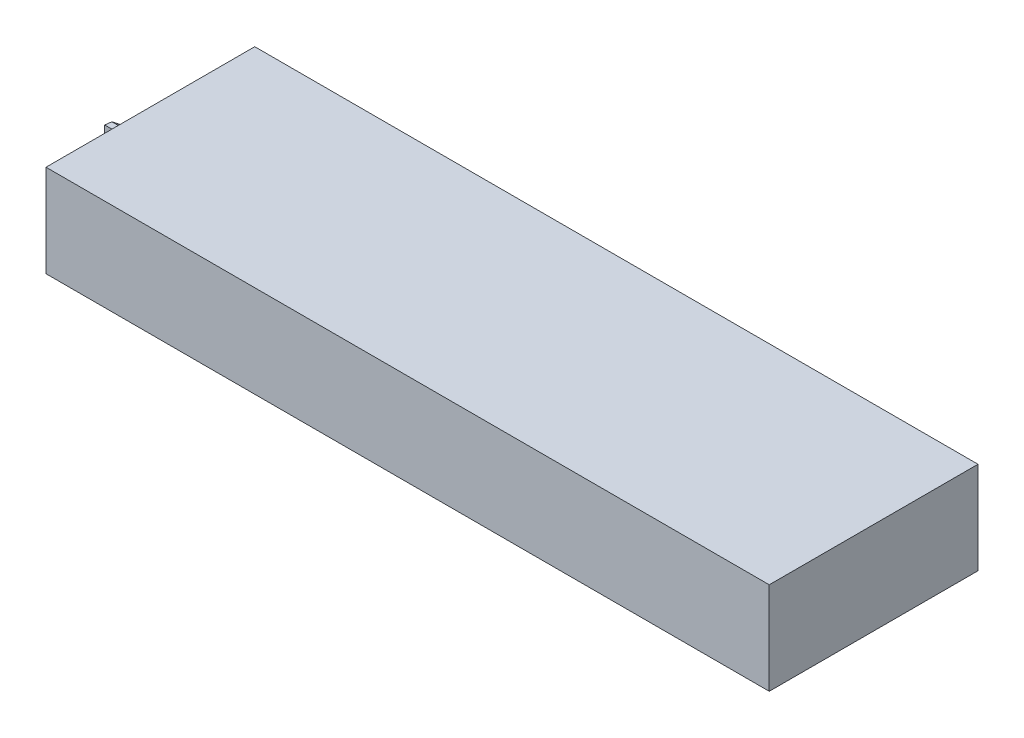
ISO-10303-21;
HEADER;
FILE_DESCRIPTION(('STEP AP214'),'2;1');
FILE_NAME('part.step','',(''),(''),'','','');
FILE_SCHEMA(('AUTOMOTIVE_DESIGN { 1 0 10303 214 1 1 1 1 }'));
ENDSEC;
DATA;
#1=APPLICATION_CONTEXT('core data for automotive mechanical design processes');
#2=APPLICATION_PROTOCOL_DEFINITION('international standard','automotive_design',2000,#1);
#3=PRODUCT_CONTEXT('',#1,'mechanical');
#4=PRODUCT('Part','Part','',(#3));
#5=PRODUCT_RELATED_PRODUCT_CATEGORY('part','',(#4));
#6=PRODUCT_DEFINITION_FORMATION('','',#4);
#7=PRODUCT_DEFINITION_CONTEXT('part definition',#1,'design');
#8=PRODUCT_DEFINITION('design','',#6,#7);
#9=PRODUCT_DEFINITION_SHAPE('','',#8);
#10=(LENGTH_UNIT() NAMED_UNIT(*) SI_UNIT(.MILLI.,.METRE.));
#11=(NAMED_UNIT(*) PLANE_ANGLE_UNIT() SI_UNIT($,.RADIAN.));
#12=(NAMED_UNIT(*) SI_UNIT($,.STERADIAN.) SOLID_ANGLE_UNIT());
#13=UNCERTAINTY_MEASURE_WITH_UNIT(LENGTH_MEASURE(1.E-05),#10,'distance_accuracy_value','');
#14=(GEOMETRIC_REPRESENTATION_CONTEXT(3) GLOBAL_UNCERTAINTY_ASSIGNED_CONTEXT((#13)) GLOBAL_UNIT_ASSIGNED_CONTEXT((#10,
#11,#12)) REPRESENTATION_CONTEXT('',''));
#15=CARTESIAN_POINT('',(0.,0.,0.));
#16=DIRECTION('',(0.,0.,1.));
#17=DIRECTION('',(1.,0.,0.));
#18=AXIS2_PLACEMENT_3D('',#15,#16,#17);
#19=CARTESIAN_POINT('',(-11.,2.8067,-3.175));
#20=DIRECTION('',(1.,0.,0.));
#21=DIRECTION('',(0.,0.,-1.));
#22=AXIS2_PLACEMENT_3D('',#19,#20,#21);
#23=PLANE('',#22);
#24=DIRECTION('',(0.,0.,1.));
#25=VECTOR('',#24,1.);
#26=CARTESIAN_POINT('',(-11.,0.,-3.175));
#27=LINE('',#26,#25);
#28=CARTESIAN_POINT('',(-11.,0.,-3.175));
#29=VERTEX_POINT('',#28);
#30=CARTESIAN_POINT('',(-11.,0.,3.175));
#31=VERTEX_POINT('',#30);
#32=EDGE_CURVE('E354',#29,#31,#27,.T.);
#33=ORIENTED_EDGE('',*,*,#32,.T.);
#34=DIRECTION('',(0.,-1.,0.));
#35=VECTOR('',#34,1.);
#36=CARTESIAN_POINT('',(-11.,2.8067,3.175));
#37=LINE('',#36,#35);
#38=CARTESIAN_POINT('',(-11.,2.8067,3.175));
#39=VERTEX_POINT('',#38);
#40=EDGE_CURVE('E359',#39,#31,#37,.T.);
#41=ORIENTED_EDGE('',*,*,#40,.F.);
#42=DIRECTION('',(0.,0.,1.));
#43=VECTOR('',#42,1.);
#44=CARTESIAN_POINT('',(-11.,2.8067,-3.175));
#45=LINE('',#44,#43);
#46=CARTESIAN_POINT('',(-11.,2.8067,-3.175));
#47=VERTEX_POINT('',#46);
#48=EDGE_CURVE('E345',#47,#39,#45,.T.);
#49=ORIENTED_EDGE('',*,*,#48,.F.);
#50=DIRECTION('',(0.,-1.,0.));
#51=VECTOR('',#50,1.);
#52=CARTESIAN_POINT('',(-11.,2.8067,-3.175));
#53=LINE('',#52,#51);
#54=EDGE_CURVE('E362',#47,#29,#53,.T.);
#55=ORIENTED_EDGE('',*,*,#54,.T.);
#56=EDGE_LOOP('',(#33,#41,#49,#55));
#57=FACE_BOUND('',#56,.T.);
#58=DIRECTION('',(0.,0.,1.));
#59=VECTOR('',#58,1.);
#60=CARTESIAN_POINT('',(-11.,0.92094923076923,0.));
#61=LINE('',#60,#59);
#62=CARTESIAN_POINT('',(-11.,0.92094923076923,0.578007692307692));
#63=VERTEX_POINT('',#62);
#64=CARTESIAN_POINT('',(-11.,0.92094923076923,1.2357));
#65=VERTEX_POINT('',#64);
#66=EDGE_CURVE('E282',#63,#65,#61,.T.);
#67=ORIENTED_EDGE('',*,*,#66,.F.);
#68=DIRECTION('',(0.,1.,0.));
#69=VECTOR('',#68,1.);
#70=CARTESIAN_POINT('',(-11.,0.,0.578007692307692));
#71=LINE('',#70,#69);
#72=CARTESIAN_POINT('',(-11.,0.574795384615383,0.578007692307692));
#73=VERTEX_POINT('',#72);
#74=EDGE_CURVE('E285',#73,#63,#71,.T.);
#75=ORIENTED_EDGE('',*,*,#74,.F.);
#76=DIRECTION('',(0.,0.,1.));
#77=VECTOR('',#76,1.);
#78=CARTESIAN_POINT('',(-11.,0.574795384615383,0.));
#79=LINE('',#78,#77);
#80=CARTESIAN_POINT('',(-11.,0.574795384615383,0.460453846153846));
#81=VERTEX_POINT('',#80);
#82=EDGE_CURVE('E291',#81,#73,#79,.T.);
#83=ORIENTED_EDGE('',*,*,#82,.F.);
#84=DIRECTION('',(0.,-1.,0.));
#85=VECTOR('',#84,1.);
#86=CARTESIAN_POINT('',(-11.,0.,0.460453846153846));
#87=LINE('',#86,#85);
#88=CARTESIAN_POINT('',(-11.,0.92094923076923,0.460453846153846));
#89=VERTEX_POINT('',#88);
#90=EDGE_CURVE('E294',#89,#81,#87,.T.);
#91=ORIENTED_EDGE('',*,*,#90,.F.);
#92=DIRECTION('',(0.,0.,1.));
#93=VECTOR('',#92,1.);
#94=CARTESIAN_POINT('',(-11.,0.92094923076923,0.));
#95=LINE('',#94,#93);
#96=CARTESIAN_POINT('',(-11.,0.92094923076923,-1.20108461538462));
#97=VERTEX_POINT('',#96);
#98=EDGE_CURVE('E297',#97,#89,#95,.T.);
#99=ORIENTED_EDGE('',*,*,#98,.F.);
#100=DIRECTION('',(0.,-1.,0.));
#101=VECTOR('',#100,1.);
#102=CARTESIAN_POINT('',(-11.,0.,-1.20108461538462));
#103=LINE('',#102,#101);
#104=CARTESIAN_POINT('',(-11.,0.992746849367293,-1.20108461538462));
#105=VERTEX_POINT('',#104);
#106=EDGE_CURVE('E300',#105,#97,#103,.T.);
#107=ORIENTED_EDGE('',*,*,#106,.F.);
#108=DIRECTION('',(0.,-0.610507860339303,-0.792010197196934));
#109=VECTOR('',#108,1.);
#110=CARTESIAN_POINT('',(-11.,1.20348897845503,-0.927689420892418));
#111=LINE('',#110,#109);
#112=CARTESIAN_POINT('',(-11.,2.21542615384615,0.38509394177715));
#113=VERTEX_POINT('',#112);
#114=EDGE_CURVE('E303',#113,#105,#111,.T.);
#115=ORIENTED_EDGE('',*,*,#114,.F.);
#116=DIRECTION('',(0.,0.,-1.));
#117=VECTOR('',#116,1.);
#118=CARTESIAN_POINT('',(-11.,2.21542615384615,0.));
#119=LINE('',#118,#117);
#120=CARTESIAN_POINT('',(-11.,2.21542615384615,0.578007692307692));
#121=VERTEX_POINT('',#120);
#122=EDGE_CURVE('E306',#121,#113,#119,.T.);
#123=ORIENTED_EDGE('',*,*,#122,.F.);
#124=DIRECTION('',(0.,1.,0.));
#125=VECTOR('',#124,1.);
#126=CARTESIAN_POINT('',(-11.,0.,0.578007692307692));
#127=LINE('',#126,#125);
#128=CARTESIAN_POINT('',(-11.,1.03850307692308,0.578007692307692));
#129=VERTEX_POINT('',#128);
#130=EDGE_CURVE('E309',#129,#121,#127,.T.);
#131=ORIENTED_EDGE('',*,*,#130,.F.);
#132=DIRECTION('',(0.,0.,-1.));
#133=VECTOR('',#132,1.);
#134=CARTESIAN_POINT('',(-11.,1.03850307692308,0.));
#135=LINE('',#134,#133);
#136=CARTESIAN_POINT('',(-11.,1.03850307692308,1.2357));
#137=VERTEX_POINT('',#136);
#138=EDGE_CURVE('E312',#137,#129,#135,.T.);
#139=ORIENTED_EDGE('',*,*,#138,.F.);
#140=DIRECTION('',(0.,1.,0.));
#141=VECTOR('',#140,1.);
#142=CARTESIAN_POINT('',(-11.,0.,1.2357));
#143=LINE('',#142,#141);
#144=EDGE_CURVE('E315',#65,#137,#143,.T.);
#145=ORIENTED_EDGE('',*,*,#144,.F.);
#146=EDGE_LOOP('',(#67,#75,#83,#91,#99,#107,#115,#123,#131,#139,#145));
#147=FACE_BOUND('',#146,.T.);
#148=ADVANCED_FACE('F139',(#57,#147),#23,.F.);
#149=CARTESIAN_POINT('',(11.,2.8067,-3.175));
#150=DIRECTION('',(-1.,0.,0.));
#151=DIRECTION('',(0.,0.,1.));
#152=AXIS2_PLACEMENT_3D('',#149,#150,#151);
#153=PLANE('',#152);
#154=DIRECTION('',(0.,0.,-1.));
#155=VECTOR('',#154,1.);
#156=CARTESIAN_POINT('',(11.,0.,-3.175));
#157=LINE('',#156,#155);
#158=CARTESIAN_POINT('',(11.,0.,3.175));
#159=VERTEX_POINT('',#158);
#160=CARTESIAN_POINT('',(11.,0.,-3.175));
#161=VERTEX_POINT('',#160);
#162=EDGE_CURVE('E338',#159,#161,#157,.T.);
#163=ORIENTED_EDGE('',*,*,#162,.T.);
#164=DIRECTION('',(0.,-1.,0.));
#165=VECTOR('',#164,1.);
#166=CARTESIAN_POINT('',(11.,2.8067,-3.175));
#167=LINE('',#166,#165);
#168=CARTESIAN_POINT('',(11.,2.8067,-3.175));
#169=VERTEX_POINT('',#168);
#170=EDGE_CURVE('E365',#169,#161,#167,.T.);
#171=ORIENTED_EDGE('',*,*,#170,.F.);
#172=DIRECTION('',(0.,0.,-1.));
#173=VECTOR('',#172,1.);
#174=CARTESIAN_POINT('',(11.,2.8067,-3.175));
#175=LINE('',#174,#173);
#176=CARTESIAN_POINT('',(11.,2.8067,3.175));
#177=VERTEX_POINT('',#176);
#178=EDGE_CURVE('E339',#177,#169,#175,.T.);
#179=ORIENTED_EDGE('',*,*,#178,.F.);
#180=DIRECTION('',(0.,-1.,0.));
#181=VECTOR('',#180,1.);
#182=CARTESIAN_POINT('',(11.,2.8067,3.175));
#183=LINE('',#182,#181);
#184=EDGE_CURVE('E349',#177,#159,#183,.T.);
#185=ORIENTED_EDGE('',*,*,#184,.T.);
#186=EDGE_LOOP('',(#163,#171,#179,#185));
#187=FACE_BOUND('',#186,.T.);
#188=ADVANCED_FACE('F141',(#187),#153,.F.);
#189=CARTESIAN_POINT('',(11.,2.8067,-3.175));
#190=DIRECTION('',(0.,0.,1.));
#191=DIRECTION('',(1.,0.,0.));
#192=AXIS2_PLACEMENT_3D('',#189,#190,#191);
#193=PLANE('',#192);
#194=DIRECTION('',(-1.,0.,0.));
#195=VECTOR('',#194,1.);
#196=CARTESIAN_POINT('',(11.,0.,-3.175));
#197=LINE('',#196,#195);
#198=EDGE_CURVE('E352',#161,#29,#197,.T.);
#199=ORIENTED_EDGE('',*,*,#198,.T.);
#200=ORIENTED_EDGE('',*,*,#54,.F.);
#201=DIRECTION('',(-1.,0.,0.));
#202=VECTOR('',#201,1.);
#203=CARTESIAN_POINT('',(11.,2.8067,-3.175));
#204=LINE('',#203,#202);
#205=EDGE_CURVE('E342',#169,#47,#204,.T.);
#206=ORIENTED_EDGE('',*,*,#205,.F.);
#207=ORIENTED_EDGE('',*,*,#170,.T.);
#208=EDGE_LOOP('',(#199,#200,#206,#207));
#209=FACE_BOUND('',#208,.T.);
#210=ADVANCED_FACE('F414',(#209),#193,.F.);
#211=CARTESIAN_POINT('',(11.,2.8067,3.175));
#212=DIRECTION('',(0.,0.,-1.));
#213=DIRECTION('',(-1.,0.,0.));
#214=AXIS2_PLACEMENT_3D('',#211,#212,#213);
#215=PLANE('',#214);
#216=DIRECTION('',(1.,0.,0.));
#217=VECTOR('',#216,1.);
#218=CARTESIAN_POINT('',(11.,0.,3.175));
#219=LINE('',#218,#217);
#220=EDGE_CURVE('E343',#31,#159,#219,.T.);
#221=ORIENTED_EDGE('',*,*,#220,.T.);
#222=ORIENTED_EDGE('',*,*,#184,.F.);
#223=DIRECTION('',(1.,0.,0.));
#224=VECTOR('',#223,1.);
#225=CARTESIAN_POINT('',(11.,2.8067,3.175));
#226=LINE('',#225,#224);
#227=EDGE_CURVE('E347',#39,#177,#226,.T.);
#228=ORIENTED_EDGE('',*,*,#227,.F.);
#229=ORIENTED_EDGE('',*,*,#40,.T.);
#230=EDGE_LOOP('',(#221,#222,#228,#229));
#231=FACE_BOUND('',#230,.T.);
#232=ADVANCED_FACE('F587',(#231),#215,.F.);
#233=CARTESIAN_POINT('',(0.,2.8067,0.));
#234=DIRECTION('',(0.,-1.,0.));
#235=DIRECTION('',(0.,0.,-1.));
#236=AXIS2_PLACEMENT_3D('',#233,#234,#235);
#237=PLANE('',#236);
#238=ORIENTED_EDGE('',*,*,#178,.T.);
#239=ORIENTED_EDGE('',*,*,#205,.T.);
#240=ORIENTED_EDGE('',*,*,#48,.T.);
#241=ORIENTED_EDGE('',*,*,#227,.T.);
#242=EDGE_LOOP('',(#238,#239,#240,#241));
#243=FACE_BOUND('',#242,.T.);
#244=ADVANCED_FACE('F575',(#243),#237,.F.);
#245=CARTESIAN_POINT('',(0.,0.,0.));
#246=DIRECTION('',(0.,-1.,0.));
#247=DIRECTION('',(0.,0.,-1.));
#248=AXIS2_PLACEMENT_3D('',#245,#246,#247);
#249=PLANE('',#248);
#250=ORIENTED_EDGE('',*,*,#162,.F.);
#251=ORIENTED_EDGE('',*,*,#220,.F.);
#252=ORIENTED_EDGE('',*,*,#32,.F.);
#253=ORIENTED_EDGE('',*,*,#198,.F.);
#254=EDGE_LOOP('',(#250,#251,#252,#253));
#255=FACE_BOUND('',#254,.T.);
#256=ADVANCED_FACE('F559',(#255),#249,.T.);
#257=CARTESIAN_POINT('',(-12.0054159532332,0.92094923076923,0.));
#258=DIRECTION('',(0.,1.,0.));
#259=DIRECTION('',(0.,0.,1.));
#260=AXIS2_PLACEMENT_3D('',#257,#258,#259);
#261=PLANE('',#260);
#262=CARTESIAN_POINT('',(-15.73075,0.920949230769229,0.));
#263=DIRECTION('',(0.,1.,0.));
#264=DIRECTION('',(0.,0.,1.));
#265=AXIS2_PLACEMENT_3D('',#262,#263,#264);
#266=CIRCLE('',#265,3.9624);
#267=CARTESIAN_POINT('',(-11.965957938013,0.92094923076923,1.2357));
#268=VERTEX_POINT('',#267);
#269=CARTESIAN_POINT('',(-11.8107345832404,0.92094923076923,0.578007692307692));
#270=VERTEX_POINT('',#269);
#271=EDGE_CURVE('E388',#268,#270,#266,.T.);
#272=ORIENTED_EDGE('',*,*,#271,.T.);
#273=DIRECTION('',(1.,0.,0.));
#274=VECTOR('',#273,1.);
#275=CARTESIAN_POINT('',(-12.0054159532332,0.92094923076923,0.578007692307692));
#276=LINE('',#275,#274);
#277=EDGE_CURVE('E336',#270,#63,#276,.T.);
#278=ORIENTED_EDGE('',*,*,#277,.T.);
#279=ORIENTED_EDGE('',*,*,#66,.T.);
#280=DIRECTION('',(1.,0.,0.));
#281=VECTOR('',#280,1.);
#282=CARTESIAN_POINT('',(-12.0054159532332,0.92094923076923,1.2357));
#283=LINE('',#282,#281);
#284=EDGE_CURVE('E317',#268,#65,#283,.T.);
#285=ORIENTED_EDGE('',*,*,#284,.F.);
#286=EDGE_LOOP('',(#272,#278,#279,#285));
#287=FACE_BOUND('',#286,.T.);
#288=ADVANCED_FACE('F549',(#287),#261,.F.);
#289=CARTESIAN_POINT('',(-12.0054159532332,0.,0.578007692307692));
#290=DIRECTION('',(0.,0.,-1.));
#291=DIRECTION('',(-1.,0.,0.));
#292=AXIS2_PLACEMENT_3D('',#289,#290,#291);
#293=PLANE('',#292);
#294=DIRECTION('',(0.,-1.,0.));
#295=VECTOR('',#294,1.);
#296=CARTESIAN_POINT('',(-11.8107345832404,15.1445341731219,0.578007692307692));
#297=LINE('',#296,#295);
#298=CARTESIAN_POINT('',(-11.8107345832404,0.574795384615382,0.578007692307692));
#299=VERTEX_POINT('',#298);
#300=EDGE_CURVE('E386',#270,#299,#297,.T.);
#301=ORIENTED_EDGE('',*,*,#300,.T.);
#302=DIRECTION('',(1.,0.,0.));
#303=VECTOR('',#302,1.);
#304=CARTESIAN_POINT('',(-12.0054159532332,0.574795384615383,0.578007692307692));
#305=LINE('',#304,#303);
#306=EDGE_CURVE('E334',#299,#73,#305,.T.);
#307=ORIENTED_EDGE('',*,*,#306,.T.);
#308=ORIENTED_EDGE('',*,*,#74,.T.);
#309=ORIENTED_EDGE('',*,*,#277,.F.);
#310=EDGE_LOOP('',(#301,#307,#308,#309));
#311=FACE_BOUND('',#310,.T.);
#312=ADVANCED_FACE('F538',(#311),#293,.F.);
#313=CARTESIAN_POINT('',(-12.0054159532332,0.574795384615383,0.));
#314=DIRECTION('',(0.,1.,0.));
#315=DIRECTION('',(0.,0.,1.));
#316=AXIS2_PLACEMENT_3D('',#313,#314,#315);
#317=PLANE('',#316);
#318=CARTESIAN_POINT('',(-15.73075,0.574795384615382,0.));
#319=DIRECTION('',(0.,1.,0.));
#320=DIRECTION('',(0.,0.,1.));
#321=AXIS2_PLACEMENT_3D('',#318,#319,#320);
#322=CIRCLE('',#321,3.9624);
#323=CARTESIAN_POINT('',(-11.7951946369588,0.574795384615383,0.460453846153846));
#324=VERTEX_POINT('',#323);
#325=EDGE_CURVE('E384',#299,#324,#322,.T.);
#326=ORIENTED_EDGE('',*,*,#325,.T.);
#327=DIRECTION('',(1.,0.,0.));
#328=VECTOR('',#327,1.);
#329=CARTESIAN_POINT('',(-12.0054159532332,0.574795384615383,0.460453846153846));
#330=LINE('',#329,#328);
#331=EDGE_CURVE('E332',#324,#81,#330,.T.);
#332=ORIENTED_EDGE('',*,*,#331,.T.);
#333=ORIENTED_EDGE('',*,*,#82,.T.);
#334=ORIENTED_EDGE('',*,*,#306,.F.);
#335=EDGE_LOOP('',(#326,#332,#333,#334));
#336=FACE_BOUND('',#335,.T.);
#337=ADVANCED_FACE('F527',(#336),#317,.F.);
#338=CARTESIAN_POINT('',(-12.0054159532332,0.,0.460453846153846));
#339=DIRECTION('',(0.,0.,1.));
#340=DIRECTION('',(1.,0.,0.));
#341=AXIS2_PLACEMENT_3D('',#338,#339,#340);
#342=PLANE('',#341);
#343=DIRECTION('',(0.,-1.,0.));
#344=VECTOR('',#343,1.);
#345=CARTESIAN_POINT('',(-11.7951946369588,15.1445341731219,0.460453846153846));
#346=LINE('',#345,#344);
#347=CARTESIAN_POINT('',(-11.7951946369588,0.920949230769229,0.460453846153846));
#348=VERTEX_POINT('',#347);
#349=EDGE_CURVE('E382',#324,#348,#346,.F.);
#350=ORIENTED_EDGE('',*,*,#349,.T.);
#351=DIRECTION('',(1.,0.,0.));
#352=VECTOR('',#351,1.);
#353=CARTESIAN_POINT('',(-12.0054159532332,0.92094923076923,0.460453846153846));
#354=LINE('',#353,#352);
#355=EDGE_CURVE('E330',#348,#89,#354,.T.);
#356=ORIENTED_EDGE('',*,*,#355,.T.);
#357=ORIENTED_EDGE('',*,*,#90,.T.);
#358=ORIENTED_EDGE('',*,*,#331,.F.);
#359=EDGE_LOOP('',(#350,#356,#357,#358));
#360=FACE_BOUND('',#359,.T.);
#361=ADVANCED_FACE('F516',(#360),#342,.F.);
#362=CARTESIAN_POINT('',(-12.0054159532332,0.92094923076923,0.));
#363=DIRECTION('',(0.,1.,0.));
#364=DIRECTION('',(0.,0.,1.));
#365=AXIS2_PLACEMENT_3D('',#362,#363,#364);
#366=PLANE('',#365);
#367=CARTESIAN_POINT('',(-15.73075,0.920949230769229,0.));
#368=DIRECTION('',(0.,1.,0.));
#369=DIRECTION('',(0.,0.,1.));
#370=AXIS2_PLACEMENT_3D('',#367,#368,#369);
#371=CIRCLE('',#370,3.9624);
#372=CARTESIAN_POINT('',(-11.9547720463188,0.92094923076923,-1.20108461538462));
#373=VERTEX_POINT('',#372);
#374=EDGE_CURVE('E380',#348,#373,#371,.T.);
#375=ORIENTED_EDGE('',*,*,#374,.T.);
#376=DIRECTION('',(1.,0.,0.));
#377=VECTOR('',#376,1.);
#378=CARTESIAN_POINT('',(-12.0054159532332,0.92094923076923,-1.20108461538462));
#379=LINE('',#378,#377);
#380=EDGE_CURVE('E328',#373,#97,#379,.T.);
#381=ORIENTED_EDGE('',*,*,#380,.T.);
#382=ORIENTED_EDGE('',*,*,#98,.T.);
#383=ORIENTED_EDGE('',*,*,#355,.F.);
#384=EDGE_LOOP('',(#375,#381,#382,#383));
#385=FACE_BOUND('',#384,.T.);
#386=ADVANCED_FACE('F505',(#385),#366,.F.);
#387=CARTESIAN_POINT('',(-12.0054159532332,0.,-1.20108461538462));
#388=DIRECTION('',(0.,0.,1.));
#389=DIRECTION('',(1.,0.,0.));
#390=AXIS2_PLACEMENT_3D('',#387,#388,#389);
#391=PLANE('',#390);
#392=DIRECTION('',(0.,-1.,0.));
#393=VECTOR('',#392,1.);
#394=CARTESIAN_POINT('',(-11.9547720463188,15.1445341731219,-1.20108461538462));
#395=LINE('',#394,#393);
#396=CARTESIAN_POINT('',(-11.9547720463188,0.992746849367293,-1.20108461538462));
#397=VERTEX_POINT('',#396);
#398=EDGE_CURVE('E378',#373,#397,#395,.F.);
#399=ORIENTED_EDGE('',*,*,#398,.T.);
#400=DIRECTION('',(1.,0.,0.));
#401=VECTOR('',#400,1.);
#402=CARTESIAN_POINT('',(-12.0054159532332,0.992746849367293,-1.20108461538462));
#403=LINE('',#402,#401);
#404=EDGE_CURVE('E326',#397,#105,#403,.T.);
#405=ORIENTED_EDGE('',*,*,#404,.T.);
#406=ORIENTED_EDGE('',*,*,#106,.T.);
#407=ORIENTED_EDGE('',*,*,#380,.F.);
#408=EDGE_LOOP('',(#399,#405,#406,#407));
#409=FACE_BOUND('',#408,.T.);
#410=ADVANCED_FACE('F494',(#409),#391,.F.);
#411=CARTESIAN_POINT('',(-12.0054159532332,1.20348897845503,-0.927689420892418));
#412=DIRECTION('',(0.,-0.792010197196934,0.610507860339303));
#413=DIRECTION('',(0.,-0.610507860339303,-0.792010197196934));
#414=AXIS2_PLACEMENT_3D('',#411,#412,#413);
#415=PLANE('',#414);
#416=CARTESIAN_POINT('',(-15.73075,1.9185829070596,0.));
#417=DIRECTION('',(0.,-0.792010197196934,0.610507860339303));
#418=DIRECTION('',(0.,-0.610507860339303,-0.792010197196934));
#419=AXIS2_PLACEMENT_3D('',#416,#417,#418);
#420=ELLIPSE('',#419,5.00296588860048,3.9624);
#421=CARTESIAN_POINT('',(-11.7871074685316,2.21542615384615,0.38509394177715));
#422=VERTEX_POINT('',#421);
#423=EDGE_CURVE('E376',#397,#422,#420,.T.);
#424=ORIENTED_EDGE('',*,*,#423,.T.);
#425=DIRECTION('',(1.,0.,0.));
#426=VECTOR('',#425,1.);
#427=CARTESIAN_POINT('',(-12.0054159532332,2.21542615384615,0.38509394177715));
#428=LINE('',#427,#426);
#429=EDGE_CURVE('E324',#422,#113,#428,.T.);
#430=ORIENTED_EDGE('',*,*,#429,.T.);
#431=ORIENTED_EDGE('',*,*,#114,.T.);
#432=ORIENTED_EDGE('',*,*,#404,.F.);
#433=EDGE_LOOP('',(#424,#430,#431,#432));
#434=FACE_BOUND('',#433,.T.);
#435=ADVANCED_FACE('F483',(#434),#415,.F.);
#436=CARTESIAN_POINT('',(-12.0054159532332,2.21542615384615,0.));
#437=DIRECTION('',(0.,-1.,0.));
#438=DIRECTION('',(0.,0.,-1.));
#439=AXIS2_PLACEMENT_3D('',#436,#437,#438);
#440=PLANE('',#439);
#441=CARTESIAN_POINT('',(-15.73075,2.21542615384615,0.));
#442=DIRECTION('',(0.,-1.,0.));
#443=DIRECTION('',(0.,0.,-1.));
#444=AXIS2_PLACEMENT_3D('',#441,#442,#443);
#445=CIRCLE('',#444,3.9624);
#446=CARTESIAN_POINT('',(-11.8107345832404,2.21542615384615,0.578007692307692));
#447=VERTEX_POINT('',#446);
#448=EDGE_CURVE('E374',#422,#447,#445,.T.);
#449=ORIENTED_EDGE('',*,*,#448,.T.);
#450=DIRECTION('',(1.,0.,0.));
#451=VECTOR('',#450,1.);
#452=CARTESIAN_POINT('',(-12.0054159532332,2.21542615384615,0.578007692307692));
#453=LINE('',#452,#451);
#454=EDGE_CURVE('E322',#447,#121,#453,.T.);
#455=ORIENTED_EDGE('',*,*,#454,.T.);
#456=ORIENTED_EDGE('',*,*,#122,.T.);
#457=ORIENTED_EDGE('',*,*,#429,.F.);
#458=EDGE_LOOP('',(#449,#455,#456,#457));
#459=FACE_BOUND('',#458,.T.);
#460=ADVANCED_FACE('F472',(#459),#440,.F.);
#461=CARTESIAN_POINT('',(-12.0054159532332,0.,0.578007692307692));
#462=DIRECTION('',(0.,0.,-1.));
#463=DIRECTION('',(-1.,0.,0.));
#464=AXIS2_PLACEMENT_3D('',#461,#462,#463);
#465=PLANE('',#464);
#466=DIRECTION('',(0.,-1.,0.));
#467=VECTOR('',#466,1.);
#468=CARTESIAN_POINT('',(-11.8107345832404,15.1445341731219,0.578007692307692));
#469=LINE('',#468,#467);
#470=CARTESIAN_POINT('',(-11.8107345832404,1.03850307692308,0.578007692307692));
#471=VERTEX_POINT('',#470);
#472=EDGE_CURVE('E372',#447,#471,#469,.T.);
#473=ORIENTED_EDGE('',*,*,#472,.T.);
#474=DIRECTION('',(1.,0.,0.));
#475=VECTOR('',#474,1.);
#476=CARTESIAN_POINT('',(-12.0054159532332,1.03850307692308,0.578007692307692));
#477=LINE('',#476,#475);
#478=EDGE_CURVE('E320',#471,#129,#477,.T.);
#479=ORIENTED_EDGE('',*,*,#478,.T.);
#480=ORIENTED_EDGE('',*,*,#130,.T.);
#481=ORIENTED_EDGE('',*,*,#454,.F.);
#482=EDGE_LOOP('',(#473,#479,#480,#481));
#483=FACE_BOUND('',#482,.T.);
#484=ADVANCED_FACE('F461',(#483),#465,.F.);
#485=CARTESIAN_POINT('',(-12.0054159532332,1.03850307692308,0.));
#486=DIRECTION('',(0.,-1.,0.));
#487=DIRECTION('',(0.,0.,-1.));
#488=AXIS2_PLACEMENT_3D('',#485,#486,#487);
#489=PLANE('',#488);
#490=CARTESIAN_POINT('',(-15.73075,1.03850307692308,0.));
#491=DIRECTION('',(0.,-1.,0.));
#492=DIRECTION('',(0.,0.,-1.));
#493=AXIS2_PLACEMENT_3D('',#490,#491,#492);
#494=CIRCLE('',#493,3.9624);
#495=CARTESIAN_POINT('',(-11.965957938013,1.03850307692308,1.2357));
#496=VERTEX_POINT('',#495);
#497=EDGE_CURVE('E370',#471,#496,#494,.T.);
#498=ORIENTED_EDGE('',*,*,#497,.T.);
#499=DIRECTION('',(1.,0.,0.));
#500=VECTOR('',#499,1.);
#501=CARTESIAN_POINT('',(-12.0054159532332,1.03850307692308,1.2357));
#502=LINE('',#501,#500);
#503=EDGE_CURVE('E162',#496,#137,#502,.T.);
#504=ORIENTED_EDGE('',*,*,#503,.T.);
#505=ORIENTED_EDGE('',*,*,#138,.T.);
#506=ORIENTED_EDGE('',*,*,#478,.F.);
#507=EDGE_LOOP('',(#498,#504,#505,#506));
#508=FACE_BOUND('',#507,.T.);
#509=ADVANCED_FACE('F451',(#508),#489,.F.);
#510=CARTESIAN_POINT('',(-12.0054159532332,0.,1.2357));
#511=DIRECTION('',(0.,0.,-1.));
#512=DIRECTION('',(-1.,0.,0.));
#513=AXIS2_PLACEMENT_3D('',#510,#511,#512);
#514=PLANE('',#513);
#515=DIRECTION('',(0.,-1.,0.));
#516=VECTOR('',#515,1.);
#517=CARTESIAN_POINT('',(-11.965957938013,15.1445341731219,1.2357));
#518=LINE('',#517,#516);
#519=EDGE_CURVE('E368',#496,#268,#518,.T.);
#520=ORIENTED_EDGE('',*,*,#519,.T.);
#521=ORIENTED_EDGE('',*,*,#284,.T.);
#522=ORIENTED_EDGE('',*,*,#144,.T.);
#523=ORIENTED_EDGE('',*,*,#503,.F.);
#524=EDGE_LOOP('',(#520,#521,#522,#523));
#525=FACE_BOUND('',#524,.T.);
#526=ADVANCED_FACE('F404',(#525),#514,.F.);
#527=CARTESIAN_POINT('',(-15.73075,15.1445341731219,0.));
#528=DIRECTION('',(0.,-1.,0.));
#529=DIRECTION('',(0.,0.,-1.));
#530=AXIS2_PLACEMENT_3D('',#527,#528,#529);
#531=CYLINDRICAL_SURFACE('',#530,3.9624);
#532=ORIENTED_EDGE('',*,*,#271,.F.);
#533=ORIENTED_EDGE('',*,*,#519,.F.);
#534=ORIENTED_EDGE('',*,*,#497,.F.);
#535=ORIENTED_EDGE('',*,*,#472,.F.);
#536=ORIENTED_EDGE('',*,*,#448,.F.);
#537=ORIENTED_EDGE('',*,*,#423,.F.);
#538=ORIENTED_EDGE('',*,*,#398,.F.);
#539=ORIENTED_EDGE('',*,*,#374,.F.);
#540=ORIENTED_EDGE('',*,*,#349,.F.);
#541=ORIENTED_EDGE('',*,*,#325,.F.);
#542=ORIENTED_EDGE('',*,*,#300,.F.);
#543=EDGE_LOOP('',(#532,#533,#534,#535,#536,#537,#538,#539,#540,#541,#542));
#544=FACE_BOUND('',#543,.T.);
#545=DIRECTION('',(0.,-1.,0.));
#546=VECTOR('',#545,1.);
#547=CARTESIAN_POINT('',(-11.7951946369588,15.1445341731219,0.460453846153846));
#548=LINE('',#547,#546);
#549=CARTESIAN_POINT('',(-11.7951946369588,2.13486933960012,0.460453846153846));
#550=VERTEX_POINT('',#549);
#551=CARTESIAN_POINT('',(-11.7951946369588,1.03850307692308,0.460453846153846));
#552=VERTEX_POINT('',#551);
#553=EDGE_CURVE('E147',#550,#552,#548,.T.);
#554=ORIENTED_EDGE('',*,*,#553,.T.);
#555=CARTESIAN_POINT('',(-15.73075,1.03850307692308,0.));
#556=DIRECTION('',(0.,1.,0.));
#557=DIRECTION('',(0.,0.,1.));
#558=AXIS2_PLACEMENT_3D('',#555,#556,#557);
#559=CIRCLE('',#558,3.9624);
#560=CARTESIAN_POINT('',(-11.8868557504576,1.03850307692308,-0.961816384938016));
#561=VERTEX_POINT('',#560);
#562=EDGE_CURVE('E12',#552,#561,#559,.T.);
#563=ORIENTED_EDGE('',*,*,#562,.T.);
#564=CARTESIAN_POINT('',(-15.73075,1.77992549601323,0.));
#565=DIRECTION('',(0.,-0.792001322549561,0.610519373222297));
#566=DIRECTION('',(0.,-0.610519373222297,-0.792001322549561));
#567=AXIS2_PLACEMENT_3D('',#564,#565,#566);
#568=ELLIPSE('',#567,5.00302194855495,3.9624);
#569=EDGE_CURVE('E390',#561,#550,#568,.T.);
#570=ORIENTED_EDGE('',*,*,#569,.T.);
#571=EDGE_LOOP('',(#554,#563,#570));
#572=FACE_BOUND('',#571,.T.);
#573=ADVANCED_FACE('F392',(#544,#572),#531,.F.);
#574=CARTESIAN_POINT('',(-12.0054159532332,1.03850307692308,0.));
#575=DIRECTION('',(0.,1.,0.));
#576=DIRECTION('',(0.,0.,1.));
#577=AXIS2_PLACEMENT_3D('',#574,#575,#576);
#578=PLANE('',#577);
#579=DIRECTION('',(1.,0.,0.));
#580=VECTOR('',#579,1.);
#581=CARTESIAN_POINT('',(-12.0054159532332,1.03850307692308,0.460453846153846));
#582=LINE('',#581,#580);
#583=CARTESIAN_POINT('',(-11.,1.03850307692308,0.460453846153846));
#584=VERTEX_POINT('',#583);
#585=EDGE_CURVE('E269',#552,#584,#582,.T.);
#586=ORIENTED_EDGE('',*,*,#585,.T.);
#587=DIRECTION('',(0.,0.,1.));
#588=VECTOR('',#587,1.);
#589=CARTESIAN_POINT('',(-11.,1.03850307692308,0.));
#590=LINE('',#589,#588);
#591=CARTESIAN_POINT('',(-11.,1.03850307692308,-0.961816384938016));
#592=VERTEX_POINT('',#591);
#593=EDGE_CURVE('E277',#592,#584,#590,.T.);
#594=ORIENTED_EDGE('',*,*,#593,.F.);
#595=DIRECTION('',(1.,0.,0.));
#596=VECTOR('',#595,1.);
#597=CARTESIAN_POINT('',(-12.0054159532332,1.03850307692308,-0.961816384938016));
#598=LINE('',#597,#596);
#599=EDGE_CURVE('E281',#561,#592,#598,.T.);
#600=ORIENTED_EDGE('',*,*,#599,.F.);
#601=ORIENTED_EDGE('',*,*,#562,.F.);
#602=EDGE_LOOP('',(#586,#594,#600,#601));
#603=FACE_BOUND('',#602,.T.);
#604=ADVANCED_FACE('F394',(#603),#578,.T.);
#605=CARTESIAN_POINT('',(-12.0054159532332,0.,0.460453846153846));
#606=DIRECTION('',(0.,0.,-1.));
#607=DIRECTION('',(-1.,0.,0.));
#608=AXIS2_PLACEMENT_3D('',#605,#606,#607);
#609=PLANE('',#608);
#610=DIRECTION('',(1.,0.,0.));
#611=VECTOR('',#610,1.);
#612=CARTESIAN_POINT('',(-12.0054159532332,2.13486933960012,0.460453846153846));
#613=LINE('',#612,#611);
#614=CARTESIAN_POINT('',(-11.,2.13486933960012,0.460453846153846));
#615=VERTEX_POINT('',#614);
#616=EDGE_CURVE('E154',#550,#615,#613,.T.);
#617=ORIENTED_EDGE('',*,*,#616,.T.);
#618=DIRECTION('',(0.,1.,0.));
#619=VECTOR('',#618,1.);
#620=CARTESIAN_POINT('',(-11.,0.,0.460453846153846));
#621=LINE('',#620,#619);
#622=EDGE_CURVE('E266',#584,#615,#621,.T.);
#623=ORIENTED_EDGE('',*,*,#622,.F.);
#624=ORIENTED_EDGE('',*,*,#585,.F.);
#625=ORIENTED_EDGE('',*,*,#553,.F.);
#626=EDGE_LOOP('',(#617,#623,#624,#625));
#627=FACE_BOUND('',#626,.T.);
#628=ADVANCED_FACE('F264',(#627),#609,.T.);
#629=CARTESIAN_POINT('',(-12.0054159532332,1.11648691513321,-0.86065120376787));
#630=DIRECTION('',(0.,-0.792001322549561,0.610519373222297));
#631=DIRECTION('',(0.,-0.610519373222297,-0.792001322549561));
#632=AXIS2_PLACEMENT_3D('',#629,#630,#631);
#633=PLANE('',#632);
#634=ORIENTED_EDGE('',*,*,#599,.T.);
#635=DIRECTION('',(0.,-0.610519373222297,-0.792001322549561));
#636=VECTOR('',#635,1.);
#637=CARTESIAN_POINT('',(-11.,1.11648691513321,-0.86065120376787));
#638=LINE('',#637,#636);
#639=EDGE_CURVE('E275',#615,#592,#638,.T.);
#640=ORIENTED_EDGE('',*,*,#639,.F.);
#641=ORIENTED_EDGE('',*,*,#616,.F.);
#642=ORIENTED_EDGE('',*,*,#569,.F.);
#643=EDGE_LOOP('',(#634,#640,#641,#642));
#644=FACE_BOUND('',#643,.T.);
#645=ADVANCED_FACE('F279',(#644),#633,.T.);
#646=ORIENTED_EDGE('',*,*,#639,.T.);
#647=ORIENTED_EDGE('',*,*,#593,.T.);
#648=ORIENTED_EDGE('',*,*,#622,.T.);
#649=EDGE_LOOP('',(#646,#647,#648));
#650=FACE_BOUND('',#649,.T.);
#651=ADVANCED_FACE('F274',(#650),#23,.F.);
#652=CLOSED_SHELL('',(#148,#188,#210,#232,#244,#256,#288,#312,#337,#361,#386,#410,#435,#460,
#484,#509,#526,#573,#604,#628,#645,#651));
#653=MANIFOLD_SOLID_BREP('B2',#652);
#654=ADVANCED_BREP_SHAPE_REPRESENTATION('',(#18,#653),#14);
#655=SHAPE_DEFINITION_REPRESENTATION(#9,#654);
ENDSEC;
END-ISO-10303-21;
